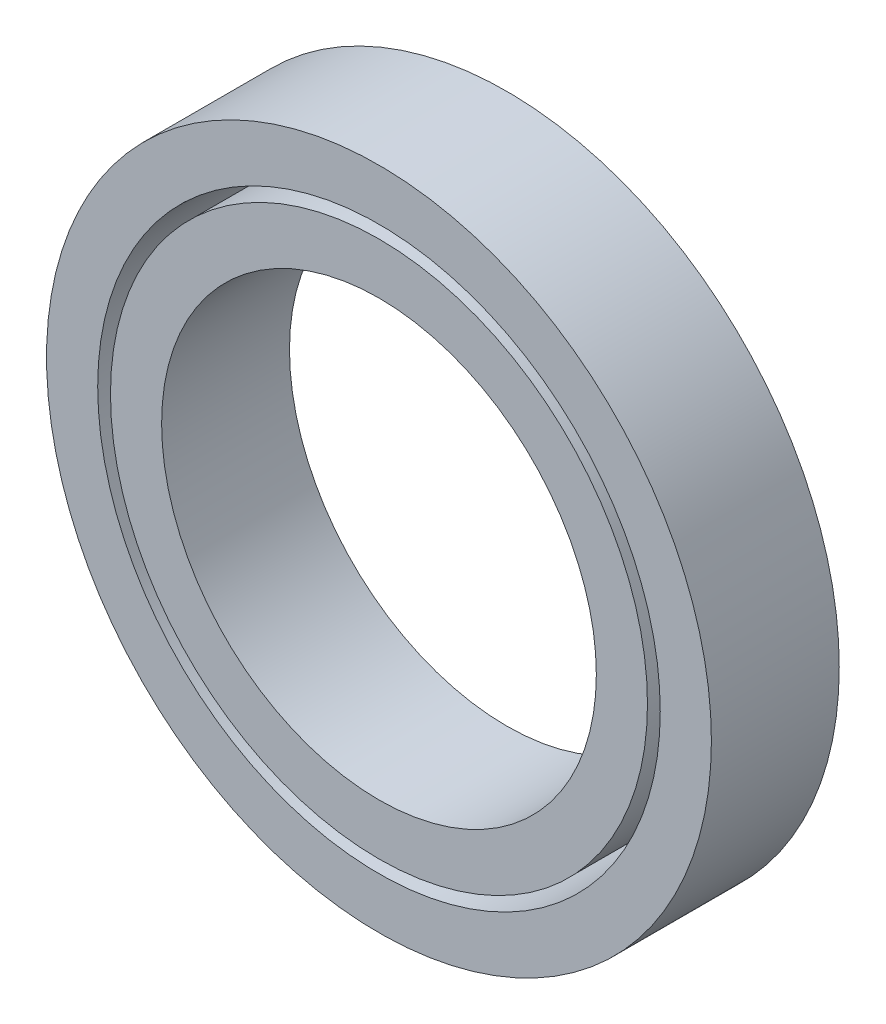
ISO-10303-21;
HEADER;
FILE_DESCRIPTION(('STEP AP214'),'2;1');
FILE_NAME('part.step','',(''),(''),'','','');
FILE_SCHEMA(('AUTOMOTIVE_DESIGN { 1 0 10303 214 1 1 1 1 }'));
ENDSEC;
DATA;
#1=APPLICATION_CONTEXT('core data for automotive mechanical design processes');
#2=APPLICATION_PROTOCOL_DEFINITION('international standard','automotive_design',2000,#1);
#3=PRODUCT_CONTEXT('',#1,'mechanical');
#4=PRODUCT('Part','Part','',(#3));
#5=PRODUCT_RELATED_PRODUCT_CATEGORY('part','',(#4));
#6=PRODUCT_DEFINITION_FORMATION('','',#4);
#7=PRODUCT_DEFINITION_CONTEXT('part definition',#1,'design');
#8=PRODUCT_DEFINITION('design','',#6,#7);
#9=PRODUCT_DEFINITION_SHAPE('','',#8);
#10=(LENGTH_UNIT() NAMED_UNIT(*) SI_UNIT(.MILLI.,.METRE.));
#11=(NAMED_UNIT(*) PLANE_ANGLE_UNIT() SI_UNIT($,.RADIAN.));
#12=(NAMED_UNIT(*) SI_UNIT($,.STERADIAN.) SOLID_ANGLE_UNIT());
#13=UNCERTAINTY_MEASURE_WITH_UNIT(LENGTH_MEASURE(1.E-05),#10,'distance_accuracy_value','');
#14=(GEOMETRIC_REPRESENTATION_CONTEXT(3) GLOBAL_UNCERTAINTY_ASSIGNED_CONTEXT((#13)) GLOBAL_UNIT_ASSIGNED_CONTEXT((#10,
#11,#12)) REPRESENTATION_CONTEXT('',''));
#15=CARTESIAN_POINT('',(0.,0.,0.));
#16=DIRECTION('',(0.,0.,1.));
#17=DIRECTION('',(1.,0.,0.));
#18=AXIS2_PLACEMENT_3D('',#15,#16,#17);
#19=CARTESIAN_POINT('',(0.,0.,6.62228636444444));
#20=DIRECTION('',(0.,0.,1.));
#21=DIRECTION('',(1.,0.,0.));
#22=AXIS2_PLACEMENT_3D('',#19,#20,#21);
#23=CYLINDRICAL_SURFACE('',#22,11.);
#24=CARTESIAN_POINT('',(0.,0.,0.));
#25=DIRECTION('',(0.,0.,1.));
#26=DIRECTION('',(1.,0.,0.));
#27=AXIS2_PLACEMENT_3D('',#24,#25,#26);
#28=CIRCLE('',#27,11.);
#29=CARTESIAN_POINT('',(11.,0.,0.));
#30=VERTEX_POINT('',#29);
#31=EDGE_CURVE('E65',#30,#30,#28,.T.);
#32=ORIENTED_EDGE('',*,*,#31,.T.);
#33=EDGE_LOOP('',(#32));
#34=FACE_BOUND('',#33,.T.);
#35=CARTESIAN_POINT('',(0.,0.,-5.));
#36=DIRECTION('',(0.,0.,1.));
#37=DIRECTION('',(1.,0.,0.));
#38=AXIS2_PLACEMENT_3D('',#35,#36,#37);
#39=CIRCLE('',#38,11.);
#40=CARTESIAN_POINT('',(11.,0.,-5.));
#41=VERTEX_POINT('',#40);
#42=EDGE_CURVE('E11',#41,#41,#39,.T.);
#43=ORIENTED_EDGE('',*,*,#42,.F.);
#44=EDGE_LOOP('',(#43));
#45=FACE_BOUND('',#44,.T.);
#46=ADVANCED_FACE('F51',(#34,#45),#23,.F.);
#47=CARTESIAN_POINT('',(11.,0.,-5.));
#48=DIRECTION('',(0.,0.,-1.));
#49=DIRECTION('',(-1.,0.,0.));
#50=AXIS2_PLACEMENT_3D('',#47,#48,#49);
#51=PLANE('',#50);
#52=ORIENTED_EDGE('',*,*,#42,.T.);
#53=EDGE_LOOP('',(#52));
#54=FACE_BOUND('',#53,.T.);
#55=CARTESIAN_POINT('',(0.,0.,-5.));
#56=DIRECTION('',(0.,0.,1.));
#57=DIRECTION('',(1.,0.,0.));
#58=AXIS2_PLACEMENT_3D('',#55,#56,#57);
#59=CIRCLE('',#58,13.);
#60=CARTESIAN_POINT('',(13.,0.,-5.));
#61=VERTEX_POINT('',#60);
#62=EDGE_CURVE('E57',#61,#61,#59,.T.);
#63=ORIENTED_EDGE('',*,*,#62,.F.);
#64=EDGE_LOOP('',(#63));
#65=FACE_BOUND('',#64,.T.);
#66=ADVANCED_FACE('F81',(#54,#65),#51,.T.);
#67=CARTESIAN_POINT('',(0.,0.,6.62228636444444));
#68=DIRECTION('',(0.,0.,1.));
#69=DIRECTION('',(1.,0.,0.));
#70=AXIS2_PLACEMENT_3D('',#67,#68,#69);
#71=CYLINDRICAL_SURFACE('',#70,13.);
#72=ORIENTED_EDGE('',*,*,#62,.T.);
#73=EDGE_LOOP('',(#72));
#74=FACE_BOUND('',#73,.T.);
#75=CARTESIAN_POINT('',(0.,0.,0.));
#76=DIRECTION('',(0.,0.,1.));
#77=DIRECTION('',(1.,0.,0.));
#78=AXIS2_PLACEMENT_3D('',#75,#76,#77);
#79=CIRCLE('',#78,13.);
#80=CARTESIAN_POINT('',(13.,0.,0.));
#81=VERTEX_POINT('',#80);
#82=EDGE_CURVE('E61',#81,#81,#79,.T.);
#83=ORIENTED_EDGE('',*,*,#82,.F.);
#84=EDGE_LOOP('',(#83));
#85=FACE_BOUND('',#84,.T.);
#86=ADVANCED_FACE('F75',(#74,#85),#71,.T.);
#87=CARTESIAN_POINT('',(11.,0.,0.));
#88=DIRECTION('',(0.,0.,1.));
#89=DIRECTION('',(1.,0.,0.));
#90=AXIS2_PLACEMENT_3D('',#87,#88,#89);
#91=PLANE('',#90);
#92=ORIENTED_EDGE('',*,*,#82,.T.);
#93=EDGE_LOOP('',(#92));
#94=FACE_BOUND('',#93,.T.);
#95=ORIENTED_EDGE('',*,*,#31,.F.);
#96=EDGE_LOOP('',(#95));
#97=FACE_BOUND('',#96,.T.);
#98=ADVANCED_FACE('F73',(#94,#97),#91,.T.);
#99=CLOSED_SHELL('',(#46,#66,#86,#98));
#100=MANIFOLD_SOLID_BREP('B2',#99);
#101=CARTESIAN_POINT('',(0.,0.,6.62228636444444));
#102=DIRECTION('',(0.,0.,1.));
#103=DIRECTION('',(1.,0.,0.));
#104=AXIS2_PLACEMENT_3D('',#101,#102,#103);
#105=CYLINDRICAL_SURFACE('',#104,8.5);
#106=CARTESIAN_POINT('',(0.,0.,0.));
#107=DIRECTION('',(0.,0.,1.));
#108=DIRECTION('',(1.,0.,0.));
#109=AXIS2_PLACEMENT_3D('',#106,#107,#108);
#110=CIRCLE('',#109,8.5);
#111=CARTESIAN_POINT('',(8.5,0.,0.));
#112=VERTEX_POINT('',#111);
#113=EDGE_CURVE('E133',#112,#112,#110,.T.);
#114=ORIENTED_EDGE('',*,*,#113,.T.);
#115=EDGE_LOOP('',(#114));
#116=FACE_BOUND('',#115,.T.);
#117=CARTESIAN_POINT('',(0.,0.,-5.));
#118=DIRECTION('',(0.,0.,1.));
#119=DIRECTION('',(1.,0.,0.));
#120=AXIS2_PLACEMENT_3D('',#117,#118,#119);
#121=CIRCLE('',#120,8.5);
#122=CARTESIAN_POINT('',(8.5,0.,-5.));
#123=VERTEX_POINT('',#122);
#124=EDGE_CURVE('E50',#123,#123,#121,.T.);
#125=ORIENTED_EDGE('',*,*,#124,.F.);
#126=EDGE_LOOP('',(#125));
#127=FACE_BOUND('',#126,.T.);
#128=ADVANCED_FACE('F119',(#116,#127),#105,.F.);
#129=CARTESIAN_POINT('',(8.5,0.,-5.));
#130=DIRECTION('',(0.,0.,-1.));
#131=DIRECTION('',(-1.,0.,0.));
#132=AXIS2_PLACEMENT_3D('',#129,#130,#131);
#133=PLANE('',#132);
#134=ORIENTED_EDGE('',*,*,#124,.T.);
#135=EDGE_LOOP('',(#134));
#136=FACE_BOUND('',#135,.T.);
#137=CARTESIAN_POINT('',(0.,0.,-5.));
#138=DIRECTION('',(0.,0.,1.));
#139=DIRECTION('',(1.,0.,0.));
#140=AXIS2_PLACEMENT_3D('',#137,#138,#139);
#141=CIRCLE('',#140,10.5);
#142=CARTESIAN_POINT('',(10.5,0.,-5.));
#143=VERTEX_POINT('',#142);
#144=EDGE_CURVE('E125',#143,#143,#141,.T.);
#145=ORIENTED_EDGE('',*,*,#144,.F.);
#146=EDGE_LOOP('',(#145));
#147=FACE_BOUND('',#146,.T.);
#148=ADVANCED_FACE('F149',(#136,#147),#133,.T.);
#149=CARTESIAN_POINT('',(0.,0.,6.62228636444444));
#150=DIRECTION('',(0.,0.,1.));
#151=DIRECTION('',(1.,0.,0.));
#152=AXIS2_PLACEMENT_3D('',#149,#150,#151);
#153=CYLINDRICAL_SURFACE('',#152,10.5);
#154=ORIENTED_EDGE('',*,*,#144,.T.);
#155=EDGE_LOOP('',(#154));
#156=FACE_BOUND('',#155,.T.);
#157=CARTESIAN_POINT('',(0.,0.,0.));
#158=DIRECTION('',(0.,0.,1.));
#159=DIRECTION('',(1.,0.,0.));
#160=AXIS2_PLACEMENT_3D('',#157,#158,#159);
#161=CIRCLE('',#160,10.5);
#162=CARTESIAN_POINT('',(10.5,0.,0.));
#163=VERTEX_POINT('',#162);
#164=EDGE_CURVE('E129',#163,#163,#161,.T.);
#165=ORIENTED_EDGE('',*,*,#164,.F.);
#166=EDGE_LOOP('',(#165));
#167=FACE_BOUND('',#166,.T.);
#168=ADVANCED_FACE('F143',(#156,#167),#153,.T.);
#169=CARTESIAN_POINT('',(8.5,0.,0.));
#170=DIRECTION('',(0.,0.,1.));
#171=DIRECTION('',(1.,0.,0.));
#172=AXIS2_PLACEMENT_3D('',#169,#170,#171);
#173=PLANE('',#172);
#174=ORIENTED_EDGE('',*,*,#164,.T.);
#175=EDGE_LOOP('',(#174));
#176=FACE_BOUND('',#175,.T.);
#177=ORIENTED_EDGE('',*,*,#113,.F.);
#178=EDGE_LOOP('',(#177));
#179=FACE_BOUND('',#178,.T.);
#180=ADVANCED_FACE('F141',(#176,#179),#173,.T.);
#181=CLOSED_SHELL('',(#128,#148,#168,#180));
#182=MANIFOLD_SOLID_BREP('B6',#181);
#183=ADVANCED_BREP_SHAPE_REPRESENTATION('',(#18,#100,#182),#14);
#184=SHAPE_DEFINITION_REPRESENTATION(#9,#183);
ENDSEC;
END-ISO-10303-21;
